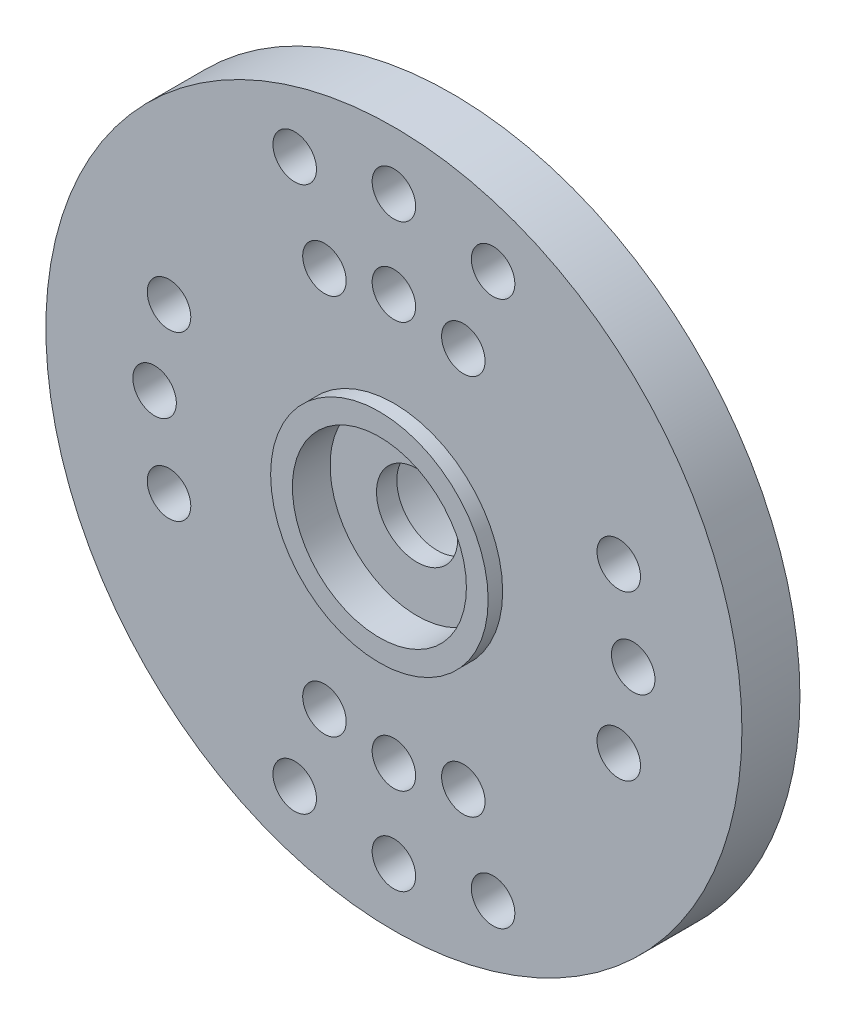
ISO-10303-21;
HEADER;
FILE_DESCRIPTION(('STEP AP214'),'2;1');
FILE_NAME('part.step','',(''),(''),'','','');
FILE_SCHEMA(('AUTOMOTIVE_DESIGN { 1 0 10303 214 1 1 1 1 }'));
ENDSEC;
DATA;
#1=APPLICATION_CONTEXT('core data for automotive mechanical design processes');
#2=APPLICATION_PROTOCOL_DEFINITION('international standard','automotive_design',2000,#1);
#3=PRODUCT_CONTEXT('',#1,'mechanical');
#4=PRODUCT('Part','Part','',(#3));
#5=PRODUCT_RELATED_PRODUCT_CATEGORY('part','',(#4));
#6=PRODUCT_DEFINITION_FORMATION('','',#4);
#7=PRODUCT_DEFINITION_CONTEXT('part definition',#1,'design');
#8=PRODUCT_DEFINITION('design','',#6,#7);
#9=PRODUCT_DEFINITION_SHAPE('','',#8);
#10=(LENGTH_UNIT() NAMED_UNIT(*) SI_UNIT(.MILLI.,.METRE.));
#11=(NAMED_UNIT(*) PLANE_ANGLE_UNIT() SI_UNIT($,.RADIAN.));
#12=(NAMED_UNIT(*) SI_UNIT($,.STERADIAN.) SOLID_ANGLE_UNIT());
#13=UNCERTAINTY_MEASURE_WITH_UNIT(LENGTH_MEASURE(1.E-05),#10,'distance_accuracy_value','');
#14=(GEOMETRIC_REPRESENTATION_CONTEXT(3) GLOBAL_UNCERTAINTY_ASSIGNED_CONTEXT((#13)) GLOBAL_UNIT_ASSIGNED_CONTEXT((#10,
#11,#12)) REPRESENTATION_CONTEXT('',''));
#15=CARTESIAN_POINT('',(0.,0.,0.));
#16=DIRECTION('',(0.,0.,1.));
#17=DIRECTION('',(1.,0.,0.));
#18=AXIS2_PLACEMENT_3D('',#15,#16,#17);
#19=CARTESIAN_POINT('',(0.,3.,-1.5));
#20=DIRECTION('',(0.,0.,-1.));
#21=DIRECTION('',(-1.,0.,0.));
#22=AXIS2_PLACEMENT_3D('',#19,#20,#21);
#23=PLANE('',#22);
#24=CARTESIAN_POINT('',(0.,0.,-1.5));
#25=DIRECTION('',(0.,0.,1.));
#26=DIRECTION('',(1.,0.,0.));
#27=AXIS2_PLACEMENT_3D('',#24,#25,#26);
#28=CIRCLE('',#27,1.4);
#29=CARTESIAN_POINT('',(1.4,0.,-1.5));
#30=VERTEX_POINT('',#29);
#31=EDGE_CURVE('E88',#30,#30,#28,.T.);
#32=ORIENTED_EDGE('',*,*,#31,.T.);
#33=EDGE_LOOP('',(#32));
#34=FACE_BOUND('',#33,.T.);
#35=CARTESIAN_POINT('',(0.,0.,-1.5));
#36=DIRECTION('',(0.,0.,1.));
#37=DIRECTION('',(1.,0.,0.));
#38=AXIS2_PLACEMENT_3D('',#35,#36,#37);
#39=CIRCLE('',#38,3.);
#40=CARTESIAN_POINT('',(3.,0.,-1.5));
#41=VERTEX_POINT('',#40);
#42=EDGE_CURVE('E10',#41,#41,#39,.T.);
#43=ORIENTED_EDGE('',*,*,#42,.F.);
#44=EDGE_LOOP('',(#43));
#45=FACE_BOUND('',#44,.T.);
#46=ADVANCED_FACE('F37',(#34,#45),#23,.T.);
#47=CARTESIAN_POINT('',(0.,0.,50.));
#48=DIRECTION('',(0.,0.,1.));
#49=DIRECTION('',(1.,0.,0.));
#50=AXIS2_PLACEMENT_3D('',#47,#48,#49);
#51=CYLINDRICAL_SURFACE('',#50,3.);
#52=ORIENTED_EDGE('',*,*,#42,.T.);
#53=EDGE_LOOP('',(#52));
#54=FACE_BOUND('',#53,.T.);
#55=CARTESIAN_POINT('',(0.,0.,-4.5));
#56=DIRECTION('',(0.,0.,1.));
#57=DIRECTION('',(1.,0.,0.));
#58=AXIS2_PLACEMENT_3D('',#55,#56,#57);
#59=CIRCLE('',#58,3.);
#60=CARTESIAN_POINT('',(3.,0.,-4.5));
#61=VERTEX_POINT('',#60);
#62=EDGE_CURVE('E44',#61,#61,#59,.T.);
#63=ORIENTED_EDGE('',*,*,#62,.F.);
#64=EDGE_LOOP('',(#63));
#65=FACE_BOUND('',#64,.T.);
#66=ADVANCED_FACE('F301',(#54,#65),#51,.F.);
#67=CARTESIAN_POINT('',(0.,4.5,-4.5));
#68=DIRECTION('',(0.,0.,-1.));
#69=DIRECTION('',(-1.,0.,0.));
#70=AXIS2_PLACEMENT_3D('',#67,#68,#69);
#71=PLANE('',#70);
#72=ORIENTED_EDGE('',*,*,#62,.T.);
#73=EDGE_LOOP('',(#72));
#74=FACE_BOUND('',#73,.T.);
#75=CARTESIAN_POINT('',(0.,0.,-4.5));
#76=DIRECTION('',(0.,0.,1.));
#77=DIRECTION('',(1.,0.,0.));
#78=AXIS2_PLACEMENT_3D('',#75,#76,#77);
#79=CIRCLE('',#78,4.5);
#80=CARTESIAN_POINT('',(4.5,0.,-4.5));
#81=VERTEX_POINT('',#80);
#82=EDGE_CURVE('E49',#81,#81,#79,.T.);
#83=ORIENTED_EDGE('',*,*,#82,.F.);
#84=EDGE_LOOP('',(#83));
#85=FACE_BOUND('',#84,.T.);
#86=ADVANCED_FACE('F306',(#74,#85),#71,.T.);
#87=CARTESIAN_POINT('',(0.,0.,50.));
#88=DIRECTION('',(0.,0.,1.));
#89=DIRECTION('',(1.,0.,0.));
#90=AXIS2_PLACEMENT_3D('',#87,#88,#89);
#91=CYLINDRICAL_SURFACE('',#90,4.5);
#92=ORIENTED_EDGE('',*,*,#82,.T.);
#93=EDGE_LOOP('',(#92));
#94=FACE_BOUND('',#93,.T.);
#95=CARTESIAN_POINT('',(0.,0.,-2.));
#96=DIRECTION('',(0.,0.,1.));
#97=DIRECTION('',(1.,0.,0.));
#98=AXIS2_PLACEMENT_3D('',#95,#96,#97);
#99=CIRCLE('',#98,4.5);
#100=CARTESIAN_POINT('',(4.5,0.,-2.));
#101=VERTEX_POINT('',#100);
#102=EDGE_CURVE('E54',#101,#101,#99,.T.);
#103=ORIENTED_EDGE('',*,*,#102,.F.);
#104=EDGE_LOOP('',(#103));
#105=FACE_BOUND('',#104,.T.);
#106=ADVANCED_FACE('F401',(#94,#105),#91,.T.);
#107=CARTESIAN_POINT('',(0.,12.,-2.));
#108=DIRECTION('',(0.,0.,-1.));
#109=DIRECTION('',(-1.,0.,0.));
#110=AXIS2_PLACEMENT_3D('',#107,#108,#109);
#111=PLANE('',#110);
#112=CARTESIAN_POINT('',(3.42020143325573,-9.39692620786069,-2.));
#113=DIRECTION('',(0.,0.,-1.));
#114=DIRECTION('',(-1.,0.,0.));
#115=AXIS2_PLACEMENT_3D('',#112,#113,#114);
#116=CIRCLE('',#115,0.749999999998336);
#117=CARTESIAN_POINT('',(2.6702014332574,-9.39692620786069,-2.));
#118=VERTEX_POINT('',#117);
#119=EDGE_CURVE('E228',#118,#118,#116,.T.);
#120=ORIENTED_EDGE('',*,*,#119,.F.);
#121=EDGE_LOOP('',(#120));
#122=FACE_BOUND('',#121,.T.);
#123=CARTESIAN_POINT('',(2.39414100327971,-6.5778483455026,-2.));
#124=DIRECTION('',(0.,0.,-1.));
#125=DIRECTION('',(-1.,0.,0.));
#126=AXIS2_PLACEMENT_3D('',#123,#124,#125);
#127=CIRCLE('',#126,0.749999999999315);
#128=CARTESIAN_POINT('',(1.64414100328039,-6.5778483455026,-2.));
#129=VERTEX_POINT('',#128);
#130=EDGE_CURVE('E220',#129,#129,#127,.T.);
#131=ORIENTED_EDGE('',*,*,#130,.F.);
#132=EDGE_LOOP('',(#131));
#133=FACE_BOUND('',#132,.T.);
#134=CARTESIAN_POINT('',(-3.42020143325761,-9.39692620785832,-2.));
#135=DIRECTION('',(0.,0.,-1.));
#136=DIRECTION('',(-1.,0.,0.));
#137=AXIS2_PLACEMENT_3D('',#134,#135,#136);
#138=CIRCLE('',#137,0.749999999999109);
#139=CARTESIAN_POINT('',(-4.17020143325672,-9.39692620785832,-2.));
#140=VERTEX_POINT('',#139);
#141=EDGE_CURVE('E212',#140,#140,#138,.T.);
#142=ORIENTED_EDGE('',*,*,#141,.F.);
#143=EDGE_LOOP('',(#142));
#144=FACE_BOUND('',#143,.T.);
#145=CARTESIAN_POINT('',(-2.39414100327964,-6.57784834550095,-2.));
#146=DIRECTION('',(0.,0.,-1.));
#147=DIRECTION('',(-1.,0.,0.));
#148=AXIS2_PLACEMENT_3D('',#145,#146,#147);
#149=CIRCLE('',#148,0.750000000000075);
#150=CARTESIAN_POINT('',(-3.14414100327971,-6.57784834550095,-2.));
#151=VERTEX_POINT('',#150);
#152=EDGE_CURVE('E204',#151,#151,#149,.T.);
#153=ORIENTED_EDGE('',*,*,#152,.F.);
#154=EDGE_LOOP('',(#153));
#155=FACE_BOUND('',#154,.T.);
#156=CARTESIAN_POINT('',(-1.06391624818261E-12,-10.0000000000004,-2.));
#157=DIRECTION('',(0.,0.,-1.));
#158=DIRECTION('',(-1.,0.,0.));
#159=AXIS2_PLACEMENT_3D('',#156,#157,#158);
#160=CIRCLE('',#159,0.74999999999893);
#161=CARTESIAN_POINT('',(-0.749999999999994,-10.0000000000004,-2.));
#162=VERTEX_POINT('',#161);
#163=EDGE_CURVE('E196',#162,#162,#160,.T.);
#164=ORIENTED_EDGE('',*,*,#163,.F.);
#165=EDGE_LOOP('',(#164));
#166=FACE_BOUND('',#165,.T.);
#167=CARTESIAN_POINT('',(0.,-7.00000000000041,-2.));
#168=DIRECTION('',(0.,0.,-1.));
#169=DIRECTION('',(-1.,0.,0.));
#170=AXIS2_PLACEMENT_3D('',#167,#168,#169);
#171=CIRCLE('',#170,0.749999999999878);
#172=CARTESIAN_POINT('',(-0.749999999999929,-7.00000000000041,-2.));
#173=VERTEX_POINT('',#172);
#174=EDGE_CURVE('E188',#173,#173,#171,.T.);
#175=ORIENTED_EDGE('',*,*,#174,.F.);
#176=EDGE_LOOP('',(#175));
#177=FACE_BOUND('',#176,.T.);
#178=CARTESIAN_POINT('',(-3.4202014332567,9.39692620785908,-2.));
#179=DIRECTION('',(0.,0.,-1.));
#180=DIRECTION('',(-1.,0.,0.));
#181=AXIS2_PLACEMENT_3D('',#178,#179,#180);
#182=CIRCLE('',#181,0.750000000000001);
#183=CARTESIAN_POINT('',(-4.1702014332567,9.39692620785908,-2.));
#184=VERTEX_POINT('',#183);
#185=EDGE_CURVE('E180',#184,#184,#182,.T.);
#186=ORIENTED_EDGE('',*,*,#185,.F.);
#187=EDGE_LOOP('',(#186));
#188=FACE_BOUND('',#187,.T.);
#189=CARTESIAN_POINT('',(-2.39414100327969,6.57784834550136,-2.));
#190=DIRECTION('',(0.,0.,-1.));
#191=DIRECTION('',(-1.,0.,0.));
#192=AXIS2_PLACEMENT_3D('',#189,#190,#191);
#193=CIRCLE('',#192,0.749999999999999);
#194=CARTESIAN_POINT('',(-3.14414100327969,6.57784834550136,-2.));
#195=VERTEX_POINT('',#194);
#196=EDGE_CURVE('E172',#195,#195,#193,.T.);
#197=ORIENTED_EDGE('',*,*,#196,.F.);
#198=EDGE_LOOP('',(#197));
#199=FACE_BOUND('',#198,.T.);
#200=CARTESIAN_POINT('',(3.4202014332567,9.39692620785908,-2.));
#201=DIRECTION('',(0.,0.,-1.));
#202=DIRECTION('',(-1.,0.,0.));
#203=AXIS2_PLACEMENT_3D('',#200,#201,#202);
#204=CIRCLE('',#203,0.75);
#205=CARTESIAN_POINT('',(2.6702014332567,9.39692620785908,-2.));
#206=VERTEX_POINT('',#205);
#207=EDGE_CURVE('E164',#206,#206,#204,.T.);
#208=ORIENTED_EDGE('',*,*,#207,.F.);
#209=EDGE_LOOP('',(#208));
#210=FACE_BOUND('',#209,.T.);
#211=CARTESIAN_POINT('',(2.39414100327969,6.57784834550136,-2.));
#212=DIRECTION('',(0.,0.,-1.));
#213=DIRECTION('',(-1.,0.,0.));
#214=AXIS2_PLACEMENT_3D('',#211,#212,#213);
#215=CIRCLE('',#214,0.75);
#216=CARTESIAN_POINT('',(1.64414100327969,6.57784834550136,-2.));
#217=VERTEX_POINT('',#216);
#218=EDGE_CURVE('E156',#217,#217,#215,.T.);
#219=ORIENTED_EDGE('',*,*,#218,.F.);
#220=EDGE_LOOP('',(#219));
#221=FACE_BOUND('',#220,.T.);
#222=CARTESIAN_POINT('',(0.,10.,-2.));
#223=DIRECTION('',(0.,0.,-1.));
#224=DIRECTION('',(-1.,0.,0.));
#225=AXIS2_PLACEMENT_3D('',#222,#223,#224);
#226=CIRCLE('',#225,0.75);
#227=CARTESIAN_POINT('',(-0.75,10.,-2.));
#228=VERTEX_POINT('',#227);
#229=EDGE_CURVE('E148',#228,#228,#226,.T.);
#230=ORIENTED_EDGE('',*,*,#229,.F.);
#231=EDGE_LOOP('',(#230));
#232=FACE_BOUND('',#231,.T.);
#233=CARTESIAN_POINT('',(-7.75246412148376,-2.82166618243672,-2.));
#234=DIRECTION('',(0.,0.,-1.));
#235=DIRECTION('',(-1.,0.,0.));
#236=AXIS2_PLACEMENT_3D('',#233,#234,#235);
#237=CIRCLE('',#236,0.75);
#238=CARTESIAN_POINT('',(-8.50246412148376,-2.82166618243672,-2.));
#239=VERTEX_POINT('',#238);
#240=EDGE_CURVE('E140',#239,#239,#237,.T.);
#241=ORIENTED_EDGE('',*,*,#240,.F.);
#242=EDGE_LOOP('',(#241));
#243=FACE_BOUND('',#242,.T.);
#244=CARTESIAN_POINT('',(-7.75246412148372,2.82166618243683,-2.));
#245=DIRECTION('',(0.,0.,-1.));
#246=DIRECTION('',(-1.,0.,0.));
#247=AXIS2_PLACEMENT_3D('',#244,#245,#246);
#248=CIRCLE('',#247,0.75);
#249=CARTESIAN_POINT('',(-8.50246412148372,2.82166618243683,-2.));
#250=VERTEX_POINT('',#249);
#251=EDGE_CURVE('E132',#250,#250,#248,.T.);
#252=ORIENTED_EDGE('',*,*,#251,.F.);
#253=EDGE_LOOP('',(#252));
#254=FACE_BOUND('',#253,.T.);
#255=CARTESIAN_POINT('',(-8.25,0.,-2.));
#256=DIRECTION('',(0.,0.,-1.));
#257=DIRECTION('',(-1.,0.,0.));
#258=AXIS2_PLACEMENT_3D('',#255,#256,#257);
#259=CIRCLE('',#258,0.750000000000001);
#260=CARTESIAN_POINT('',(-9.,0.,-2.));
#261=VERTEX_POINT('',#260);
#262=EDGE_CURVE('E124',#261,#261,#259,.T.);
#263=ORIENTED_EDGE('',*,*,#262,.F.);
#264=EDGE_LOOP('',(#263));
#265=FACE_BOUND('',#264,.T.);
#266=CARTESIAN_POINT('',(7.75246412148374,2.82166618243677,-2.));
#267=DIRECTION('',(0.,0.,-1.));
#268=DIRECTION('',(-1.,0.,0.));
#269=AXIS2_PLACEMENT_3D('',#266,#267,#268);
#270=CIRCLE('',#269,0.75);
#271=CARTESIAN_POINT('',(7.00246412148374,2.82166618243677,-2.));
#272=VERTEX_POINT('',#271);
#273=EDGE_CURVE('E116',#272,#272,#270,.T.);
#274=ORIENTED_EDGE('',*,*,#273,.F.);
#275=EDGE_LOOP('',(#274));
#276=FACE_BOUND('',#275,.T.);
#277=CARTESIAN_POINT('',(0.,7.,-2.));
#278=DIRECTION('',(0.,0.,-1.));
#279=DIRECTION('',(-1.,0.,0.));
#280=AXIS2_PLACEMENT_3D('',#277,#278,#279);
#281=CIRCLE('',#280,0.75);
#282=CARTESIAN_POINT('',(-0.75,7.,-2.));
#283=VERTEX_POINT('',#282);
#284=EDGE_CURVE('E108',#283,#283,#281,.T.);
#285=ORIENTED_EDGE('',*,*,#284,.F.);
#286=EDGE_LOOP('',(#285));
#287=FACE_BOUND('',#286,.T.);
#288=CARTESIAN_POINT('',(7.75246412148374,-2.82166618243677,-2.));
#289=DIRECTION('',(0.,0.,-1.));
#290=DIRECTION('',(-1.,0.,0.));
#291=AXIS2_PLACEMENT_3D('',#288,#289,#290);
#292=CIRCLE('',#291,0.750000000000001);
#293=CARTESIAN_POINT('',(7.00246412148374,-2.82166618243677,-2.));
#294=VERTEX_POINT('',#293);
#295=EDGE_CURVE('E100',#294,#294,#292,.T.);
#296=ORIENTED_EDGE('',*,*,#295,.F.);
#297=EDGE_LOOP('',(#296));
#298=FACE_BOUND('',#297,.T.);
#299=CARTESIAN_POINT('',(8.25,0.,-2.));
#300=DIRECTION('',(0.,0.,-1.));
#301=DIRECTION('',(-1.,0.,0.));
#302=AXIS2_PLACEMENT_3D('',#299,#300,#301);
#303=CIRCLE('',#302,0.75);
#304=CARTESIAN_POINT('',(7.5,0.,-2.));
#305=VERTEX_POINT('',#304);
#306=EDGE_CURVE('E92',#305,#305,#303,.T.);
#307=ORIENTED_EDGE('',*,*,#306,.F.);
#308=EDGE_LOOP('',(#307));
#309=FACE_BOUND('',#308,.T.);
#310=ORIENTED_EDGE('',*,*,#102,.T.);
#311=EDGE_LOOP('',(#310));
#312=FACE_BOUND('',#311,.T.);
#313=CARTESIAN_POINT('',(0.,0.,-2.));
#314=DIRECTION('',(0.,0.,1.));
#315=DIRECTION('',(1.,0.,0.));
#316=AXIS2_PLACEMENT_3D('',#313,#314,#315);
#317=CIRCLE('',#316,12.);
#318=CARTESIAN_POINT('',(12.,0.,-2.));
#319=VERTEX_POINT('',#318);
#320=EDGE_CURVE('E60',#319,#319,#317,.T.);
#321=ORIENTED_EDGE('',*,*,#320,.F.);
#322=EDGE_LOOP('',(#321));
#323=FACE_BOUND('',#322,.T.);
#324=ADVANCED_FACE('F398',(#122,#133,#144,#155,#166,#177,#188,#199,#210,#221,#232,#243,#254,
#265,#276,#287,#298,#309,#312,#323),#111,.T.);
#325=CARTESIAN_POINT('',(0.,0.,50.));
#326=DIRECTION('',(0.,0.,1.));
#327=DIRECTION('',(1.,0.,0.));
#328=AXIS2_PLACEMENT_3D('',#325,#326,#327);
#329=CYLINDRICAL_SURFACE('',#328,12.);
#330=ORIENTED_EDGE('',*,*,#320,.T.);
#331=EDGE_LOOP('',(#330));
#332=FACE_BOUND('',#331,.T.);
#333=CARTESIAN_POINT('',(0.,0.,0.));
#334=DIRECTION('',(0.,0.,1.));
#335=DIRECTION('',(1.,0.,0.));
#336=AXIS2_PLACEMENT_3D('',#333,#334,#335);
#337=CIRCLE('',#336,12.);
#338=CARTESIAN_POINT('',(12.,0.,0.));
#339=VERTEX_POINT('',#338);
#340=EDGE_CURVE('E64',#339,#339,#337,.T.);
#341=ORIENTED_EDGE('',*,*,#340,.F.);
#342=EDGE_LOOP('',(#341));
#343=FACE_BOUND('',#342,.T.);
#344=ADVANCED_FACE('F243',(#332,#343),#329,.T.);
#345=CARTESIAN_POINT('',(0.,3.75,0.));
#346=DIRECTION('',(0.,0.,1.));
#347=DIRECTION('',(1.,0.,0.));
#348=AXIS2_PLACEMENT_3D('',#345,#346,#347);
#349=PLANE('',#348);
#350=CARTESIAN_POINT('',(3.42020143325573,-9.39692620786069,0.));
#351=DIRECTION('',(0.,0.,1.));
#352=DIRECTION('',(1.,0.,0.));
#353=AXIS2_PLACEMENT_3D('',#350,#351,#352);
#354=CIRCLE('',#353,0.749999999998336);
#355=CARTESIAN_POINT('',(4.17020143325407,-9.39692620786069,0.));
#356=VERTEX_POINT('',#355);
#357=EDGE_CURVE('E232',#356,#356,#354,.T.);
#358=ORIENTED_EDGE('',*,*,#357,.F.);
#359=EDGE_LOOP('',(#358));
#360=FACE_BOUND('',#359,.T.);
#361=CARTESIAN_POINT('',(2.39414100327971,-6.5778483455026,0.));
#362=DIRECTION('',(0.,0.,1.));
#363=DIRECTION('',(1.,0.,0.));
#364=AXIS2_PLACEMENT_3D('',#361,#362,#363);
#365=CIRCLE('',#364,0.749999999999315);
#366=CARTESIAN_POINT('',(3.14414100327902,-6.5778483455026,0.));
#367=VERTEX_POINT('',#366);
#368=EDGE_CURVE('E224',#367,#367,#365,.T.);
#369=ORIENTED_EDGE('',*,*,#368,.F.);
#370=EDGE_LOOP('',(#369));
#371=FACE_BOUND('',#370,.T.);
#372=CARTESIAN_POINT('',(-3.42020143325761,-9.39692620785832,0.));
#373=DIRECTION('',(0.,0.,1.));
#374=DIRECTION('',(1.,0.,0.));
#375=AXIS2_PLACEMENT_3D('',#372,#373,#374);
#376=CIRCLE('',#375,0.749999999999109);
#377=CARTESIAN_POINT('',(-2.6702014332585,-9.39692620785832,0.));
#378=VERTEX_POINT('',#377);
#379=EDGE_CURVE('E216',#378,#378,#376,.T.);
#380=ORIENTED_EDGE('',*,*,#379,.F.);
#381=EDGE_LOOP('',(#380));
#382=FACE_BOUND('',#381,.T.);
#383=CARTESIAN_POINT('',(-2.39414100327964,-6.57784834550095,0.));
#384=DIRECTION('',(0.,0.,1.));
#385=DIRECTION('',(1.,0.,0.));
#386=AXIS2_PLACEMENT_3D('',#383,#384,#385);
#387=CIRCLE('',#386,0.750000000000075);
#388=CARTESIAN_POINT('',(-1.64414100327956,-6.57784834550095,0.));
#389=VERTEX_POINT('',#388);
#390=EDGE_CURVE('E208',#389,#389,#387,.T.);
#391=ORIENTED_EDGE('',*,*,#390,.F.);
#392=EDGE_LOOP('',(#391));
#393=FACE_BOUND('',#392,.T.);
#394=CARTESIAN_POINT('',(-1.06391624818261E-12,-10.0000000000004,0.));
#395=DIRECTION('',(0.,0.,1.));
#396=DIRECTION('',(1.,0.,0.));
#397=AXIS2_PLACEMENT_3D('',#394,#395,#396);
#398=CIRCLE('',#397,0.74999999999893);
#399=CARTESIAN_POINT('',(0.749999999997866,-10.0000000000004,0.));
#400=VERTEX_POINT('',#399);
#401=EDGE_CURVE('E200',#400,#400,#398,.T.);
#402=ORIENTED_EDGE('',*,*,#401,.F.);
#403=EDGE_LOOP('',(#402));
#404=FACE_BOUND('',#403,.T.);
#405=CARTESIAN_POINT('',(0.,-7.00000000000041,0.));
#406=DIRECTION('',(0.,0.,1.));
#407=DIRECTION('',(1.,0.,0.));
#408=AXIS2_PLACEMENT_3D('',#405,#406,#407);
#409=CIRCLE('',#408,0.749999999999878);
#410=CARTESIAN_POINT('',(0.749999999999827,-7.00000000000041,0.));
#411=VERTEX_POINT('',#410);
#412=EDGE_CURVE('E192',#411,#411,#409,.T.);
#413=ORIENTED_EDGE('',*,*,#412,.F.);
#414=EDGE_LOOP('',(#413));
#415=FACE_BOUND('',#414,.T.);
#416=CARTESIAN_POINT('',(-3.4202014332567,9.39692620785908,0.));
#417=DIRECTION('',(0.,0.,1.));
#418=DIRECTION('',(1.,0.,0.));
#419=AXIS2_PLACEMENT_3D('',#416,#417,#418);
#420=CIRCLE('',#419,0.750000000000001);
#421=CARTESIAN_POINT('',(-2.67020143325669,9.39692620785908,0.));
#422=VERTEX_POINT('',#421);
#423=EDGE_CURVE('E184',#422,#422,#420,.T.);
#424=ORIENTED_EDGE('',*,*,#423,.F.);
#425=EDGE_LOOP('',(#424));
#426=FACE_BOUND('',#425,.T.);
#427=CARTESIAN_POINT('',(-2.39414100327969,6.57784834550136,0.));
#428=DIRECTION('',(0.,0.,1.));
#429=DIRECTION('',(1.,0.,0.));
#430=AXIS2_PLACEMENT_3D('',#427,#428,#429);
#431=CIRCLE('',#430,0.749999999999999);
#432=CARTESIAN_POINT('',(-1.64414100327969,6.57784834550136,0.));
#433=VERTEX_POINT('',#432);
#434=EDGE_CURVE('E176',#433,#433,#431,.T.);
#435=ORIENTED_EDGE('',*,*,#434,.F.);
#436=EDGE_LOOP('',(#435));
#437=FACE_BOUND('',#436,.T.);
#438=CARTESIAN_POINT('',(3.4202014332567,9.39692620785908,0.));
#439=DIRECTION('',(0.,0.,1.));
#440=DIRECTION('',(1.,0.,0.));
#441=AXIS2_PLACEMENT_3D('',#438,#439,#440);
#442=CIRCLE('',#441,0.75);
#443=CARTESIAN_POINT('',(4.1702014332567,9.39692620785908,0.));
#444=VERTEX_POINT('',#443);
#445=EDGE_CURVE('E168',#444,#444,#442,.T.);
#446=ORIENTED_EDGE('',*,*,#445,.F.);
#447=EDGE_LOOP('',(#446));
#448=FACE_BOUND('',#447,.T.);
#449=CARTESIAN_POINT('',(2.39414100327969,6.57784834550136,0.));
#450=DIRECTION('',(0.,0.,1.));
#451=DIRECTION('',(1.,0.,0.));
#452=AXIS2_PLACEMENT_3D('',#449,#450,#451);
#453=CIRCLE('',#452,0.75);
#454=CARTESIAN_POINT('',(3.14414100327969,6.57784834550136,0.));
#455=VERTEX_POINT('',#454);
#456=EDGE_CURVE('E160',#455,#455,#453,.T.);
#457=ORIENTED_EDGE('',*,*,#456,.F.);
#458=EDGE_LOOP('',(#457));
#459=FACE_BOUND('',#458,.T.);
#460=CARTESIAN_POINT('',(0.,10.,0.));
#461=DIRECTION('',(0.,0.,1.));
#462=DIRECTION('',(1.,0.,0.));
#463=AXIS2_PLACEMENT_3D('',#460,#461,#462);
#464=CIRCLE('',#463,0.75);
#465=CARTESIAN_POINT('',(0.75,10.,0.));
#466=VERTEX_POINT('',#465);
#467=EDGE_CURVE('E152',#466,#466,#464,.T.);
#468=ORIENTED_EDGE('',*,*,#467,.F.);
#469=EDGE_LOOP('',(#468));
#470=FACE_BOUND('',#469,.T.);
#471=CARTESIAN_POINT('',(-7.75246412148376,-2.82166618243672,0.));
#472=DIRECTION('',(0.,0.,1.));
#473=DIRECTION('',(1.,0.,0.));
#474=AXIS2_PLACEMENT_3D('',#471,#472,#473);
#475=CIRCLE('',#474,0.75);
#476=CARTESIAN_POINT('',(-7.00246412148376,-2.82166618243672,0.));
#477=VERTEX_POINT('',#476);
#478=EDGE_CURVE('E144',#477,#477,#475,.T.);
#479=ORIENTED_EDGE('',*,*,#478,.F.);
#480=EDGE_LOOP('',(#479));
#481=FACE_BOUND('',#480,.T.);
#482=CARTESIAN_POINT('',(-7.75246412148372,2.82166618243683,0.));
#483=DIRECTION('',(0.,0.,1.));
#484=DIRECTION('',(1.,0.,0.));
#485=AXIS2_PLACEMENT_3D('',#482,#483,#484);
#486=CIRCLE('',#485,0.75);
#487=CARTESIAN_POINT('',(-7.00246412148372,2.82166618243683,0.));
#488=VERTEX_POINT('',#487);
#489=EDGE_CURVE('E136',#488,#488,#486,.T.);
#490=ORIENTED_EDGE('',*,*,#489,.F.);
#491=EDGE_LOOP('',(#490));
#492=FACE_BOUND('',#491,.T.);
#493=CARTESIAN_POINT('',(-8.25,0.,0.));
#494=DIRECTION('',(0.,0.,1.));
#495=DIRECTION('',(1.,0.,0.));
#496=AXIS2_PLACEMENT_3D('',#493,#494,#495);
#497=CIRCLE('',#496,0.750000000000001);
#498=CARTESIAN_POINT('',(-7.5,0.,0.));
#499=VERTEX_POINT('',#498);
#500=EDGE_CURVE('E128',#499,#499,#497,.T.);
#501=ORIENTED_EDGE('',*,*,#500,.F.);
#502=EDGE_LOOP('',(#501));
#503=FACE_BOUND('',#502,.T.);
#504=CARTESIAN_POINT('',(7.75246412148374,2.82166618243677,0.));
#505=DIRECTION('',(0.,0.,1.));
#506=DIRECTION('',(1.,0.,0.));
#507=AXIS2_PLACEMENT_3D('',#504,#505,#506);
#508=CIRCLE('',#507,0.75);
#509=CARTESIAN_POINT('',(8.50246412148374,2.82166618243677,0.));
#510=VERTEX_POINT('',#509);
#511=EDGE_CURVE('E120',#510,#510,#508,.T.);
#512=ORIENTED_EDGE('',*,*,#511,.F.);
#513=EDGE_LOOP('',(#512));
#514=FACE_BOUND('',#513,.T.);
#515=CARTESIAN_POINT('',(0.,7.,0.));
#516=DIRECTION('',(0.,0.,1.));
#517=DIRECTION('',(1.,0.,0.));
#518=AXIS2_PLACEMENT_3D('',#515,#516,#517);
#519=CIRCLE('',#518,0.75);
#520=CARTESIAN_POINT('',(0.75,7.,0.));
#521=VERTEX_POINT('',#520);
#522=EDGE_CURVE('E112',#521,#521,#519,.T.);
#523=ORIENTED_EDGE('',*,*,#522,.F.);
#524=EDGE_LOOP('',(#523));
#525=FACE_BOUND('',#524,.T.);
#526=CARTESIAN_POINT('',(7.75246412148374,-2.82166618243677,0.));
#527=DIRECTION('',(0.,0.,1.));
#528=DIRECTION('',(1.,0.,0.));
#529=AXIS2_PLACEMENT_3D('',#526,#527,#528);
#530=CIRCLE('',#529,0.750000000000001);
#531=CARTESIAN_POINT('',(8.50246412148374,-2.82166618243677,0.));
#532=VERTEX_POINT('',#531);
#533=EDGE_CURVE('E104',#532,#532,#530,.T.);
#534=ORIENTED_EDGE('',*,*,#533,.F.);
#535=EDGE_LOOP('',(#534));
#536=FACE_BOUND('',#535,.T.);
#537=CARTESIAN_POINT('',(8.25,0.,0.));
#538=DIRECTION('',(0.,0.,1.));
#539=DIRECTION('',(1.,0.,0.));
#540=AXIS2_PLACEMENT_3D('',#537,#538,#539);
#541=CIRCLE('',#540,0.75);
#542=CARTESIAN_POINT('',(9.,0.,0.));
#543=VERTEX_POINT('',#542);
#544=EDGE_CURVE('E96',#543,#543,#541,.T.);
#545=ORIENTED_EDGE('',*,*,#544,.F.);
#546=EDGE_LOOP('',(#545));
#547=FACE_BOUND('',#546,.T.);
#548=ORIENTED_EDGE('',*,*,#340,.T.);
#549=EDGE_LOOP('',(#548));
#550=FACE_BOUND('',#549,.T.);
#551=CARTESIAN_POINT('',(0.,0.,0.));
#552=DIRECTION('',(0.,0.,1.));
#553=DIRECTION('',(1.,0.,0.));
#554=AXIS2_PLACEMENT_3D('',#551,#552,#553);
#555=CIRCLE('',#554,3.75);
#556=CARTESIAN_POINT('',(3.75,0.,0.));
#557=VERTEX_POINT('',#556);
#558=EDGE_CURVE('E68',#557,#557,#555,.T.);
#559=ORIENTED_EDGE('',*,*,#558,.F.);
#560=EDGE_LOOP('',(#559));
#561=FACE_BOUND('',#560,.T.);
#562=ADVANCED_FACE('F239',(#360,#371,#382,#393,#404,#415,#426,#437,#448,#459,#470,#481,#492,
#503,#514,#525,#536,#547,#550,#561),#349,.T.);
#563=CARTESIAN_POINT('',(0.,0.,50.));
#564=DIRECTION('',(0.,0.,1.));
#565=DIRECTION('',(1.,0.,0.));
#566=AXIS2_PLACEMENT_3D('',#563,#564,#565);
#567=CYLINDRICAL_SURFACE('',#566,3.75);
#568=ORIENTED_EDGE('',*,*,#558,.T.);
#569=EDGE_LOOP('',(#568));
#570=FACE_BOUND('',#569,.T.);
#571=CARTESIAN_POINT('',(0.,0.,0.5));
#572=DIRECTION('',(0.,0.,1.));
#573=DIRECTION('',(1.,0.,0.));
#574=AXIS2_PLACEMENT_3D('',#571,#572,#573);
#575=CIRCLE('',#574,3.75);
#576=CARTESIAN_POINT('',(3.75,0.,0.5));
#577=VERTEX_POINT('',#576);
#578=EDGE_CURVE('E72',#577,#577,#575,.T.);
#579=ORIENTED_EDGE('',*,*,#578,.F.);
#580=EDGE_LOOP('',(#579));
#581=FACE_BOUND('',#580,.T.);
#582=ADVANCED_FACE('F242',(#570,#581),#567,.T.);
#583=CARTESIAN_POINT('',(0.,3.75,0.5));
#584=DIRECTION('',(0.,0.,-1.));
#585=DIRECTION('',(-1.,0.,0.));
#586=AXIS2_PLACEMENT_3D('',#583,#584,#585);
#587=PLANE('',#586);
#588=CARTESIAN_POINT('',(0.,0.,0.5));
#589=DIRECTION('',(0.,0.,1.));
#590=DIRECTION('',(1.,0.,0.));
#591=AXIS2_PLACEMENT_3D('',#588,#589,#590);
#592=CIRCLE('',#591,3.);
#593=CARTESIAN_POINT('',(3.,0.,0.5));
#594=VERTEX_POINT('',#593);
#595=EDGE_CURVE('E76',#594,#594,#592,.T.);
#596=ORIENTED_EDGE('',*,*,#595,.F.);
#597=EDGE_LOOP('',(#596));
#598=FACE_BOUND('',#597,.T.);
#599=ORIENTED_EDGE('',*,*,#578,.T.);
#600=EDGE_LOOP('',(#599));
#601=FACE_BOUND('',#600,.T.);
#602=ADVANCED_FACE('F285',(#598,#601),#587,.F.);
#603=CARTESIAN_POINT('',(0.,0.,50.));
#604=DIRECTION('',(0.,0.,1.));
#605=DIRECTION('',(1.,0.,0.));
#606=AXIS2_PLACEMENT_3D('',#603,#604,#605);
#607=CYLINDRICAL_SURFACE('',#606,3.);
#608=CARTESIAN_POINT('',(0.,0.,-0.800000000000002));
#609=DIRECTION('',(0.,0.,1.));
#610=DIRECTION('',(1.,0.,0.));
#611=AXIS2_PLACEMENT_3D('',#608,#609,#610);
#612=CIRCLE('',#611,3.);
#613=CARTESIAN_POINT('',(3.,0.,-0.800000000000002));
#614=VERTEX_POINT('',#613);
#615=EDGE_CURVE('E80',#614,#614,#612,.T.);
#616=ORIENTED_EDGE('',*,*,#615,.F.);
#617=EDGE_LOOP('',(#616));
#618=FACE_BOUND('',#617,.T.);
#619=ORIENTED_EDGE('',*,*,#595,.T.);
#620=EDGE_LOOP('',(#619));
#621=FACE_BOUND('',#620,.T.);
#622=ADVANCED_FACE('F290',(#618,#621),#607,.F.);
#623=CARTESIAN_POINT('',(0.,3.,-0.8));
#624=DIRECTION('',(0.,0.,-1.));
#625=DIRECTION('',(-1.,0.,0.));
#626=AXIS2_PLACEMENT_3D('',#623,#624,#625);
#627=PLANE('',#626);
#628=CARTESIAN_POINT('',(0.,0.,-0.800000000000002));
#629=DIRECTION('',(0.,0.,1.));
#630=DIRECTION('',(1.,0.,0.));
#631=AXIS2_PLACEMENT_3D('',#628,#629,#630);
#632=CIRCLE('',#631,1.4);
#633=CARTESIAN_POINT('',(1.4,0.,-0.800000000000002));
#634=VERTEX_POINT('',#633);
#635=EDGE_CURVE('E84',#634,#634,#632,.T.);
#636=ORIENTED_EDGE('',*,*,#635,.F.);
#637=EDGE_LOOP('',(#636));
#638=FACE_BOUND('',#637,.T.);
#639=ORIENTED_EDGE('',*,*,#615,.T.);
#640=EDGE_LOOP('',(#639));
#641=FACE_BOUND('',#640,.T.);
#642=ADVANCED_FACE('F296',(#638,#641),#627,.F.);
#643=CARTESIAN_POINT('',(0.,0.,50.));
#644=DIRECTION('',(0.,0.,1.));
#645=DIRECTION('',(1.,0.,0.));
#646=AXIS2_PLACEMENT_3D('',#643,#644,#645);
#647=CYLINDRICAL_SURFACE('',#646,1.4);
#648=ORIENTED_EDGE('',*,*,#31,.F.);
#649=EDGE_LOOP('',(#648));
#650=FACE_BOUND('',#649,.T.);
#651=ORIENTED_EDGE('',*,*,#635,.T.);
#652=EDGE_LOOP('',(#651));
#653=FACE_BOUND('',#652,.T.);
#654=ADVANCED_FACE('F310',(#650,#653),#647,.F.);
#655=CARTESIAN_POINT('',(8.25,0.,-4.5));
#656=DIRECTION('',(0.,0.,1.));
#657=DIRECTION('',(1.,0.,0.));
#658=AXIS2_PLACEMENT_3D('',#655,#656,#657);
#659=CYLINDRICAL_SURFACE('',#658,0.75);
#660=ORIENTED_EDGE('',*,*,#306,.T.);
#661=EDGE_LOOP('',(#660));
#662=FACE_BOUND('',#661,.T.);
#663=ORIENTED_EDGE('',*,*,#544,.T.);
#664=EDGE_LOOP('',(#663));
#665=FACE_BOUND('',#664,.T.);
#666=ADVANCED_FACE('F313',(#662,#665),#659,.F.);
#667=CARTESIAN_POINT('',(7.75246412148374,-2.82166618243677,-4.5));
#668=DIRECTION('',(0.,0.,1.));
#669=DIRECTION('',(1.,0.,0.));
#670=AXIS2_PLACEMENT_3D('',#667,#668,#669);
#671=CYLINDRICAL_SURFACE('',#670,0.750000000000001);
#672=ORIENTED_EDGE('',*,*,#295,.T.);
#673=EDGE_LOOP('',(#672));
#674=FACE_BOUND('',#673,.T.);
#675=ORIENTED_EDGE('',*,*,#533,.T.);
#676=EDGE_LOOP('',(#675));
#677=FACE_BOUND('',#676,.T.);
#678=ADVANCED_FACE('F327',(#674,#677),#671,.F.);
#679=CARTESIAN_POINT('',(0.,7.,-4.5));
#680=DIRECTION('',(0.,0.,1.));
#681=DIRECTION('',(1.,0.,0.));
#682=AXIS2_PLACEMENT_3D('',#679,#680,#681);
#683=CYLINDRICAL_SURFACE('',#682,0.75);
#684=ORIENTED_EDGE('',*,*,#284,.T.);
#685=EDGE_LOOP('',(#684));
#686=FACE_BOUND('',#685,.T.);
#687=ORIENTED_EDGE('',*,*,#522,.T.);
#688=EDGE_LOOP('',(#687));
#689=FACE_BOUND('',#688,.T.);
#690=ADVANCED_FACE('F331',(#686,#689),#683,.F.);
#691=CARTESIAN_POINT('',(7.75246412148374,2.82166618243677,-4.5));
#692=DIRECTION('',(0.,0.,1.));
#693=DIRECTION('',(1.,0.,0.));
#694=AXIS2_PLACEMENT_3D('',#691,#692,#693);
#695=CYLINDRICAL_SURFACE('',#694,0.75);
#696=ORIENTED_EDGE('',*,*,#273,.T.);
#697=EDGE_LOOP('',(#696));
#698=FACE_BOUND('',#697,.T.);
#699=ORIENTED_EDGE('',*,*,#511,.T.);
#700=EDGE_LOOP('',(#699));
#701=FACE_BOUND('',#700,.T.);
#702=ADVANCED_FACE('F335',(#698,#701),#695,.F.);
#703=CARTESIAN_POINT('',(-8.25,0.,-4.5));
#704=DIRECTION('',(0.,0.,1.));
#705=DIRECTION('',(1.,0.,0.));
#706=AXIS2_PLACEMENT_3D('',#703,#704,#705);
#707=CYLINDRICAL_SURFACE('',#706,0.750000000000001);
#708=ORIENTED_EDGE('',*,*,#262,.T.);
#709=EDGE_LOOP('',(#708));
#710=FACE_BOUND('',#709,.T.);
#711=ORIENTED_EDGE('',*,*,#500,.T.);
#712=EDGE_LOOP('',(#711));
#713=FACE_BOUND('',#712,.T.);
#714=ADVANCED_FACE('F339',(#710,#713),#707,.F.);
#715=CARTESIAN_POINT('',(-7.75246412148372,2.82166618243683,-4.5));
#716=DIRECTION('',(0.,0.,1.));
#717=DIRECTION('',(1.,0.,0.));
#718=AXIS2_PLACEMENT_3D('',#715,#716,#717);
#719=CYLINDRICAL_SURFACE('',#718,0.75);
#720=ORIENTED_EDGE('',*,*,#251,.T.);
#721=EDGE_LOOP('',(#720));
#722=FACE_BOUND('',#721,.T.);
#723=ORIENTED_EDGE('',*,*,#489,.T.);
#724=EDGE_LOOP('',(#723));
#725=FACE_BOUND('',#724,.T.);
#726=ADVANCED_FACE('F343',(#722,#725),#719,.F.);
#727=CARTESIAN_POINT('',(-7.75246412148376,-2.82166618243672,-4.5));
#728=DIRECTION('',(0.,0.,1.));
#729=DIRECTION('',(1.,0.,0.));
#730=AXIS2_PLACEMENT_3D('',#727,#728,#729);
#731=CYLINDRICAL_SURFACE('',#730,0.75);
#732=ORIENTED_EDGE('',*,*,#240,.T.);
#733=EDGE_LOOP('',(#732));
#734=FACE_BOUND('',#733,.T.);
#735=ORIENTED_EDGE('',*,*,#478,.T.);
#736=EDGE_LOOP('',(#735));
#737=FACE_BOUND('',#736,.T.);
#738=ADVANCED_FACE('F347',(#734,#737),#731,.F.);
#739=CARTESIAN_POINT('',(0.,10.,-4.5));
#740=DIRECTION('',(0.,0.,1.));
#741=DIRECTION('',(1.,0.,0.));
#742=AXIS2_PLACEMENT_3D('',#739,#740,#741);
#743=CYLINDRICAL_SURFACE('',#742,0.75);
#744=ORIENTED_EDGE('',*,*,#229,.T.);
#745=EDGE_LOOP('',(#744));
#746=FACE_BOUND('',#745,.T.);
#747=ORIENTED_EDGE('',*,*,#467,.T.);
#748=EDGE_LOOP('',(#747));
#749=FACE_BOUND('',#748,.T.);
#750=ADVANCED_FACE('F351',(#746,#749),#743,.F.);
#751=CARTESIAN_POINT('',(2.39414100327969,6.57784834550136,-4.5));
#752=DIRECTION('',(0.,0.,1.));
#753=DIRECTION('',(1.,0.,0.));
#754=AXIS2_PLACEMENT_3D('',#751,#752,#753);
#755=CYLINDRICAL_SURFACE('',#754,0.75);
#756=ORIENTED_EDGE('',*,*,#218,.T.);
#757=EDGE_LOOP('',(#756));
#758=FACE_BOUND('',#757,.T.);
#759=ORIENTED_EDGE('',*,*,#456,.T.);
#760=EDGE_LOOP('',(#759));
#761=FACE_BOUND('',#760,.T.);
#762=ADVANCED_FACE('F355',(#758,#761),#755,.F.);
#763=CARTESIAN_POINT('',(3.4202014332567,9.39692620785908,-4.5));
#764=DIRECTION('',(0.,0.,1.));
#765=DIRECTION('',(1.,0.,0.));
#766=AXIS2_PLACEMENT_3D('',#763,#764,#765);
#767=CYLINDRICAL_SURFACE('',#766,0.75);
#768=ORIENTED_EDGE('',*,*,#207,.T.);
#769=EDGE_LOOP('',(#768));
#770=FACE_BOUND('',#769,.T.);
#771=ORIENTED_EDGE('',*,*,#445,.T.);
#772=EDGE_LOOP('',(#771));
#773=FACE_BOUND('',#772,.T.);
#774=ADVANCED_FACE('F359',(#770,#773),#767,.F.);
#775=CARTESIAN_POINT('',(-2.39414100327969,6.57784834550136,-4.5));
#776=DIRECTION('',(0.,0.,1.));
#777=DIRECTION('',(1.,0.,0.));
#778=AXIS2_PLACEMENT_3D('',#775,#776,#777);
#779=CYLINDRICAL_SURFACE('',#778,0.749999999999999);
#780=ORIENTED_EDGE('',*,*,#196,.T.);
#781=EDGE_LOOP('',(#780));
#782=FACE_BOUND('',#781,.T.);
#783=ORIENTED_EDGE('',*,*,#434,.T.);
#784=EDGE_LOOP('',(#783));
#785=FACE_BOUND('',#784,.T.);
#786=ADVANCED_FACE('F363',(#782,#785),#779,.F.);
#787=CARTESIAN_POINT('',(-3.4202014332567,9.39692620785908,-4.5));
#788=DIRECTION('',(0.,0.,1.));
#789=DIRECTION('',(1.,0.,0.));
#790=AXIS2_PLACEMENT_3D('',#787,#788,#789);
#791=CYLINDRICAL_SURFACE('',#790,0.750000000000001);
#792=ORIENTED_EDGE('',*,*,#185,.T.);
#793=EDGE_LOOP('',(#792));
#794=FACE_BOUND('',#793,.T.);
#795=ORIENTED_EDGE('',*,*,#423,.T.);
#796=EDGE_LOOP('',(#795));
#797=FACE_BOUND('',#796,.T.);
#798=ADVANCED_FACE('F367',(#794,#797),#791,.F.);
#799=CARTESIAN_POINT('',(0.,-7.00000000000041,-4.5));
#800=DIRECTION('',(0.,0.,1.));
#801=DIRECTION('',(1.,0.,0.));
#802=AXIS2_PLACEMENT_3D('',#799,#800,#801);
#803=CYLINDRICAL_SURFACE('',#802,0.749999999999878);
#804=ORIENTED_EDGE('',*,*,#174,.T.);
#805=EDGE_LOOP('',(#804));
#806=FACE_BOUND('',#805,.T.);
#807=ORIENTED_EDGE('',*,*,#412,.T.);
#808=EDGE_LOOP('',(#807));
#809=FACE_BOUND('',#808,.T.);
#810=ADVANCED_FACE('F371',(#806,#809),#803,.F.);
#811=CARTESIAN_POINT('',(-1.06391624818261E-12,-10.0000000000004,-4.5));
#812=DIRECTION('',(0.,0.,1.));
#813=DIRECTION('',(1.,0.,0.));
#814=AXIS2_PLACEMENT_3D('',#811,#812,#813);
#815=CYLINDRICAL_SURFACE('',#814,0.74999999999893);
#816=ORIENTED_EDGE('',*,*,#163,.T.);
#817=EDGE_LOOP('',(#816));
#818=FACE_BOUND('',#817,.T.);
#819=ORIENTED_EDGE('',*,*,#401,.T.);
#820=EDGE_LOOP('',(#819));
#821=FACE_BOUND('',#820,.T.);
#822=ADVANCED_FACE('F375',(#818,#821),#815,.F.);
#823=CARTESIAN_POINT('',(-2.39414100327964,-6.57784834550095,-4.5));
#824=DIRECTION('',(0.,0.,1.));
#825=DIRECTION('',(1.,0.,0.));
#826=AXIS2_PLACEMENT_3D('',#823,#824,#825);
#827=CYLINDRICAL_SURFACE('',#826,0.750000000000075);
#828=ORIENTED_EDGE('',*,*,#152,.T.);
#829=EDGE_LOOP('',(#828));
#830=FACE_BOUND('',#829,.T.);
#831=ORIENTED_EDGE('',*,*,#390,.T.);
#832=EDGE_LOOP('',(#831));
#833=FACE_BOUND('',#832,.T.);
#834=ADVANCED_FACE('F379',(#830,#833),#827,.F.);
#835=CARTESIAN_POINT('',(-3.42020143325761,-9.39692620785832,-4.5));
#836=DIRECTION('',(0.,0.,1.));
#837=DIRECTION('',(1.,0.,0.));
#838=AXIS2_PLACEMENT_3D('',#835,#836,#837);
#839=CYLINDRICAL_SURFACE('',#838,0.749999999999109);
#840=ORIENTED_EDGE('',*,*,#141,.T.);
#841=EDGE_LOOP('',(#840));
#842=FACE_BOUND('',#841,.T.);
#843=ORIENTED_EDGE('',*,*,#379,.T.);
#844=EDGE_LOOP('',(#843));
#845=FACE_BOUND('',#844,.T.);
#846=ADVANCED_FACE('F383',(#842,#845),#839,.F.);
#847=CARTESIAN_POINT('',(2.39414100327971,-6.5778483455026,-4.5));
#848=DIRECTION('',(0.,0.,1.));
#849=DIRECTION('',(1.,0.,0.));
#850=AXIS2_PLACEMENT_3D('',#847,#848,#849);
#851=CYLINDRICAL_SURFACE('',#850,0.749999999999315);
#852=ORIENTED_EDGE('',*,*,#130,.T.);
#853=EDGE_LOOP('',(#852));
#854=FACE_BOUND('',#853,.T.);
#855=ORIENTED_EDGE('',*,*,#368,.T.);
#856=EDGE_LOOP('',(#855));
#857=FACE_BOUND('',#856,.T.);
#858=ADVANCED_FACE('F387',(#854,#857),#851,.F.);
#859=CARTESIAN_POINT('',(3.42020143325573,-9.39692620786069,-4.5));
#860=DIRECTION('',(0.,0.,1.));
#861=DIRECTION('',(1.,0.,0.));
#862=AXIS2_PLACEMENT_3D('',#859,#860,#861);
#863=CYLINDRICAL_SURFACE('',#862,0.749999999998336);
#864=ORIENTED_EDGE('',*,*,#119,.T.);
#865=EDGE_LOOP('',(#864));
#866=FACE_BOUND('',#865,.T.);
#867=ORIENTED_EDGE('',*,*,#357,.T.);
#868=EDGE_LOOP('',(#867));
#869=FACE_BOUND('',#868,.T.);
#870=ADVANCED_FACE('F237',(#866,#869),#863,.F.);
#871=CLOSED_SHELL('',(#46,#66,#86,#106,#324,#344,#562,#582,#602,#622,#642,#654,#666,#678,#690,
#702,#714,#726,#738,#750,#762,#774,#786,#798,#810,#822,#834,#846,#858,#870));
#872=MANIFOLD_SOLID_BREP('B2',#871);
#873=ADVANCED_BREP_SHAPE_REPRESENTATION('',(#18,#872),#14);
#874=SHAPE_DEFINITION_REPRESENTATION(#9,#873);
ENDSEC;
END-ISO-10303-21;
